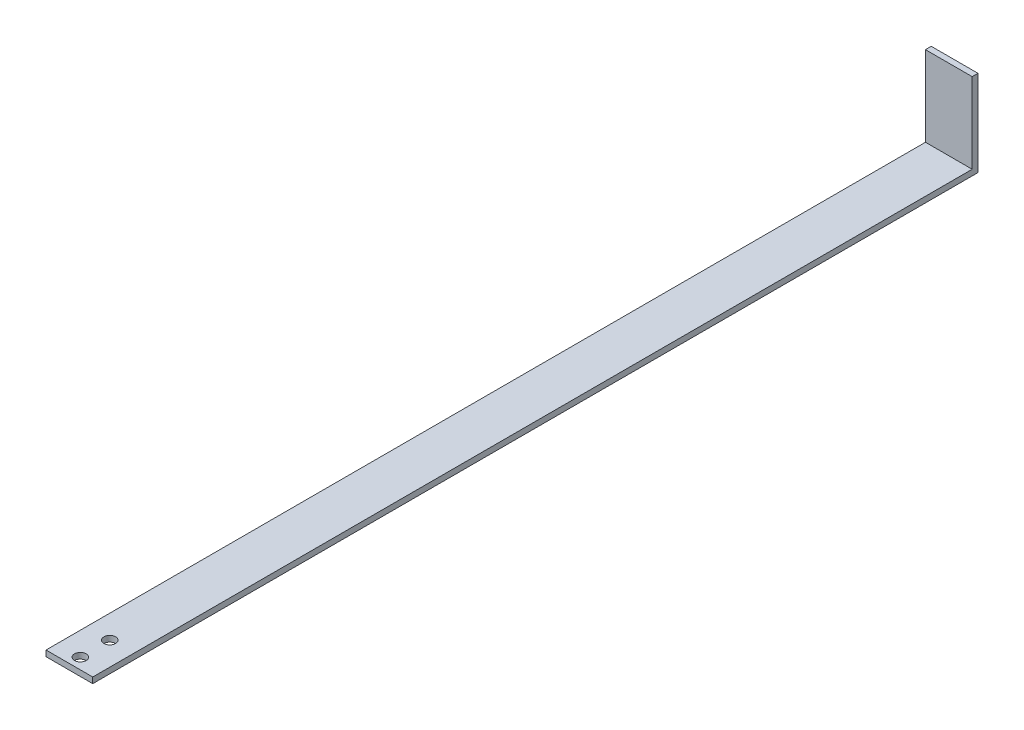
ISO-10303-21;
HEADER;
FILE_DESCRIPTION(('STEP AP214'),'2;1');
FILE_NAME('part.step','',(''),(''),'','','');
FILE_SCHEMA(('AUTOMOTIVE_DESIGN { 1 0 10303 214 1 1 1 1 }'));
ENDSEC;
DATA;
#1=APPLICATION_CONTEXT('core data for automotive mechanical design processes');
#2=APPLICATION_PROTOCOL_DEFINITION('international standard','automotive_design',2000,#1);
#3=PRODUCT_CONTEXT('',#1,'mechanical');
#4=PRODUCT('Part','Part','',(#3));
#5=PRODUCT_RELATED_PRODUCT_CATEGORY('part','',(#4));
#6=PRODUCT_DEFINITION_FORMATION('','',#4);
#7=PRODUCT_DEFINITION_CONTEXT('part definition',#1,'design');
#8=PRODUCT_DEFINITION('design','',#6,#7);
#9=PRODUCT_DEFINITION_SHAPE('','',#8);
#10=(LENGTH_UNIT() NAMED_UNIT(*) SI_UNIT(.MILLI.,.METRE.));
#11=(NAMED_UNIT(*) PLANE_ANGLE_UNIT() SI_UNIT($,.RADIAN.));
#12=(NAMED_UNIT(*) SI_UNIT($,.STERADIAN.) SOLID_ANGLE_UNIT());
#13=UNCERTAINTY_MEASURE_WITH_UNIT(LENGTH_MEASURE(1.E-05),#10,'distance_accuracy_value','');
#14=(GEOMETRIC_REPRESENTATION_CONTEXT(3) GLOBAL_UNCERTAINTY_ASSIGNED_CONTEXT((#13)) GLOBAL_UNIT_ASSIGNED_CONTEXT((#10,
#11,#12)) REPRESENTATION_CONTEXT('',''));
#15=CARTESIAN_POINT('',(0.,0.,0.));
#16=DIRECTION('',(0.,0.,1.));
#17=DIRECTION('',(1.,0.,0.));
#18=AXIS2_PLACEMENT_3D('',#15,#16,#17);
#19=CARTESIAN_POINT('',(50.8,6.3099999999999,6.31000000000004));
#20=DIRECTION('',(0.,0.,-1.));
#21=DIRECTION('',(0.,1.,0.));
#22=AXIS2_PLACEMENT_3D('',#19,#20,#21);
#23=PLANE('',#22);
#24=DIRECTION('',(0.,-1.,0.));
#25=VECTOR('',#24,1.);
#26=CARTESIAN_POINT('',(0.,6.3099999999999,6.31000000000004));
#27=LINE('',#26,#25);
#28=CARTESIAN_POINT('',(0.,93.46,6.31000000000003));
#29=VERTEX_POINT('',#28);
#30=CARTESIAN_POINT('',(0.,6.3099999999999,6.31000000000004));
#31=VERTEX_POINT('',#30);
#32=EDGE_CURVE('E117',#29,#31,#27,.T.);
#33=ORIENTED_EDGE('',*,*,#32,.T.);
#34=DIRECTION('',(-1.,0.,0.));
#35=VECTOR('',#34,1.);
#36=CARTESIAN_POINT('',(50.8,6.3099999999999,6.31000000000004));
#37=LINE('',#36,#35);
#38=CARTESIAN_POINT('',(50.8,6.3099999999999,6.31000000000004));
#39=VERTEX_POINT('',#38);
#40=EDGE_CURVE('E11',#39,#31,#37,.T.);
#41=ORIENTED_EDGE('',*,*,#40,.F.);
#42=DIRECTION('',(0.,-1.,0.));
#43=VECTOR('',#42,1.);
#44=CARTESIAN_POINT('',(50.8,6.3099999999999,6.31000000000004));
#45=LINE('',#44,#43);
#46=CARTESIAN_POINT('',(50.8,93.46,6.31000000000003));
#47=VERTEX_POINT('',#46);
#48=EDGE_CURVE('E128',#47,#39,#45,.T.);
#49=ORIENTED_EDGE('',*,*,#48,.F.);
#50=DIRECTION('',(-1.,0.,0.));
#51=VECTOR('',#50,1.);
#52=CARTESIAN_POINT('',(50.8,93.46,6.31000000000003));
#53=LINE('',#52,#51);
#54=EDGE_CURVE('E113',#47,#29,#53,.T.);
#55=ORIENTED_EDGE('',*,*,#54,.T.);
#56=EDGE_LOOP('',(#33,#41,#49,#55));
#57=FACE_BOUND('',#56,.T.);
#58=ADVANCED_FACE('F33',(#57),#23,.F.);
#59=CARTESIAN_POINT('',(50.8,6.30999999999989,962.));
#60=DIRECTION('',(0.,-1.,0.));
#61=DIRECTION('',(0.,0.,-1.));
#62=AXIS2_PLACEMENT_3D('',#59,#60,#61);
#63=PLANE('',#62);
#64=CARTESIAN_POINT('',(25.4000000000066,6.30999999999989,950.107795334271));
#65=DIRECTION('',(0.,-1.,0.));
#66=DIRECTION('',(0.,0.,-1.));
#67=AXIS2_PLACEMENT_3D('',#64,#65,#66);
#68=CIRCLE('',#67,6.34999999999999);
#69=CARTESIAN_POINT('',(25.4000000000066,6.30999999999989,943.757795334271));
#70=VERTEX_POINT('',#69);
#71=EDGE_CURVE('E176',#70,#70,#68,.T.);
#72=ORIENTED_EDGE('',*,*,#71,.T.);
#73=EDGE_LOOP('',(#72));
#74=FACE_BOUND('',#73,.T.);
#75=CARTESIAN_POINT('',(25.4000000000067,6.30999999999989,918.107795334271));
#76=DIRECTION('',(0.,-1.,0.));
#77=DIRECTION('',(0.,0.,-1.));
#78=AXIS2_PLACEMENT_3D('',#75,#76,#77);
#79=CIRCLE('',#78,6.35000000000003);
#80=CARTESIAN_POINT('',(25.4000000000067,6.30999999999989,911.757795334271));
#81=VERTEX_POINT('',#80);
#82=EDGE_CURVE('E121',#81,#81,#79,.T.);
#83=ORIENTED_EDGE('',*,*,#82,.T.);
#84=EDGE_LOOP('',(#83));
#85=FACE_BOUND('',#84,.T.);
#86=DIRECTION('',(0.,0.,1.));
#87=VECTOR('',#86,1.);
#88=CARTESIAN_POINT('',(0.,6.30999999999989,962.));
#89=LINE('',#88,#87);
#90=CARTESIAN_POINT('',(0.,6.30999999999989,962.));
#91=VERTEX_POINT('',#90);
#92=EDGE_CURVE('E120',#31,#91,#89,.T.);
#93=ORIENTED_EDGE('',*,*,#92,.T.);
#94=DIRECTION('',(-1.,0.,0.));
#95=VECTOR('',#94,1.);
#96=CARTESIAN_POINT('',(50.8,6.30999999999989,962.));
#97=LINE('',#96,#95);
#98=CARTESIAN_POINT('',(50.8,6.30999999999989,962.));
#99=VERTEX_POINT('',#98);
#100=EDGE_CURVE('E41',#99,#91,#97,.T.);
#101=ORIENTED_EDGE('',*,*,#100,.F.);
#102=DIRECTION('',(0.,0.,1.));
#103=VECTOR('',#102,1.);
#104=CARTESIAN_POINT('',(50.8,6.30999999999989,962.));
#105=LINE('',#104,#103);
#106=EDGE_CURVE('E86',#39,#99,#105,.T.);
#107=ORIENTED_EDGE('',*,*,#106,.F.);
#108=ORIENTED_EDGE('',*,*,#40,.T.);
#109=EDGE_LOOP('',(#93,#101,#107,#108));
#110=FACE_BOUND('',#109,.T.);
#111=ADVANCED_FACE('F152',(#74,#85,#110),#63,.F.);
#112=CARTESIAN_POINT('',(50.8,-1.17811022077975E-13,962.));
#113=DIRECTION('',(0.,0.,-1.));
#114=DIRECTION('',(-1.,0.,0.));
#115=AXIS2_PLACEMENT_3D('',#112,#113,#114);
#116=PLANE('',#115);
#117=DIRECTION('',(0.,-1.,0.));
#118=VECTOR('',#117,1.);
#119=CARTESIAN_POINT('',(0.,-1.17811022077975E-13,962.));
#120=LINE('',#119,#118);
#121=CARTESIAN_POINT('',(0.,-1.17811022077975E-13,962.));
#122=VERTEX_POINT('',#121);
#123=EDGE_CURVE('E123',#91,#122,#120,.T.);
#124=ORIENTED_EDGE('',*,*,#123,.T.);
#125=DIRECTION('',(-1.,0.,0.));
#126=VECTOR('',#125,1.);
#127=CARTESIAN_POINT('',(50.8,-1.17811022077975E-13,962.));
#128=LINE('',#127,#126);
#129=CARTESIAN_POINT('',(50.8,-1.17811022077975E-13,962.));
#130=VERTEX_POINT('',#129);
#131=EDGE_CURVE('E108',#130,#122,#128,.T.);
#132=ORIENTED_EDGE('',*,*,#131,.F.);
#133=DIRECTION('',(0.,-1.,0.));
#134=VECTOR('',#133,1.);
#135=CARTESIAN_POINT('',(50.8,-1.17811022077975E-13,962.));
#136=LINE('',#135,#134);
#137=EDGE_CURVE('E99',#99,#130,#136,.T.);
#138=ORIENTED_EDGE('',*,*,#137,.F.);
#139=ORIENTED_EDGE('',*,*,#100,.T.);
#140=EDGE_LOOP('',(#124,#132,#138,#139));
#141=FACE_BOUND('',#140,.T.);
#142=ADVANCED_FACE('F134',(#141),#116,.F.);
#143=CARTESIAN_POINT('',(50.8,0.,0.));
#144=DIRECTION('',(0.,1.,0.));
#145=DIRECTION('',(0.,0.,1.));
#146=AXIS2_PLACEMENT_3D('',#143,#144,#145);
#147=PLANE('',#146);
#148=CARTESIAN_POINT('',(25.4000000000066,-1.16354647040106E-13,950.107795334271));
#149=DIRECTION('',(0.,-1.,0.));
#150=DIRECTION('',(0.,0.,-1.));
#151=AXIS2_PLACEMENT_3D('',#148,#149,#150);
#152=CIRCLE('',#151,6.34999999999999);
#153=CARTESIAN_POINT('',(25.4000000000066,-1.15576996322648E-13,943.757795334271));
#154=VERTEX_POINT('',#153);
#155=EDGE_CURVE('E171',#154,#154,#152,.T.);
#156=ORIENTED_EDGE('',*,*,#155,.F.);
#157=EDGE_LOOP('',(#156));
#158=FACE_BOUND('',#157,.T.);
#159=CARTESIAN_POINT('',(25.4000000000067,-1.12435777282835E-13,918.107795334271));
#160=DIRECTION('',(0.,-1.,0.));
#161=DIRECTION('',(0.,0.,-1.));
#162=AXIS2_PLACEMENT_3D('',#159,#160,#161);
#163=CIRCLE('',#162,6.35000000000003);
#164=CARTESIAN_POINT('',(25.4000000000067,-1.11658126565376E-13,911.757795334271));
#165=VERTEX_POINT('',#164);
#166=EDGE_CURVE('E174',#165,#165,#163,.T.);
#167=ORIENTED_EDGE('',*,*,#166,.F.);
#168=EDGE_LOOP('',(#167));
#169=FACE_BOUND('',#168,.T.);
#170=DIRECTION('',(0.,0.,-1.));
#171=VECTOR('',#170,1.);
#172=CARTESIAN_POINT('',(0.,0.,0.));
#173=LINE('',#172,#171);
#174=CARTESIAN_POINT('',(0.,0.,0.));
#175=VERTEX_POINT('',#174);
#176=EDGE_CURVE('E107',#122,#175,#173,.T.);
#177=ORIENTED_EDGE('',*,*,#176,.T.);
#178=DIRECTION('',(-1.,0.,0.));
#179=VECTOR('',#178,1.);
#180=CARTESIAN_POINT('',(50.8,0.,0.));
#181=LINE('',#180,#179);
#182=CARTESIAN_POINT('',(50.8,0.,0.));
#183=VERTEX_POINT('',#182);
#184=EDGE_CURVE('E104',#183,#175,#181,.T.);
#185=ORIENTED_EDGE('',*,*,#184,.F.);
#186=DIRECTION('',(0.,0.,-1.));
#187=VECTOR('',#186,1.);
#188=CARTESIAN_POINT('',(50.8,0.,0.));
#189=LINE('',#188,#187);
#190=EDGE_CURVE('E93',#130,#183,#189,.T.);
#191=ORIENTED_EDGE('',*,*,#190,.F.);
#192=ORIENTED_EDGE('',*,*,#131,.T.);
#193=EDGE_LOOP('',(#177,#185,#191,#192));
#194=FACE_BOUND('',#193,.T.);
#195=ADVANCED_FACE('F105',(#158,#169,#194),#147,.F.);
#196=CARTESIAN_POINT('',(50.8,93.46,0.));
#197=DIRECTION('',(0.,0.,1.));
#198=DIRECTION('',(0.,-1.,0.));
#199=AXIS2_PLACEMENT_3D('',#196,#197,#198);
#200=PLANE('',#199);
#201=DIRECTION('',(0.,1.,0.));
#202=VECTOR('',#201,1.);
#203=CARTESIAN_POINT('',(0.,93.46,0.));
#204=LINE('',#203,#202);
#205=CARTESIAN_POINT('',(0.,93.46,0.));
#206=VERTEX_POINT('',#205);
#207=EDGE_CURVE('E72',#175,#206,#204,.T.);
#208=ORIENTED_EDGE('',*,*,#207,.T.);
#209=DIRECTION('',(-1.,0.,0.));
#210=VECTOR('',#209,1.);
#211=CARTESIAN_POINT('',(50.8,93.46,0.));
#212=LINE('',#211,#210);
#213=CARTESIAN_POINT('',(50.8,93.46,0.));
#214=VERTEX_POINT('',#213);
#215=EDGE_CURVE('E109',#214,#206,#212,.T.);
#216=ORIENTED_EDGE('',*,*,#215,.F.);
#217=DIRECTION('',(0.,1.,0.));
#218=VECTOR('',#217,1.);
#219=CARTESIAN_POINT('',(50.8,93.46,0.));
#220=LINE('',#219,#218);
#221=EDGE_CURVE('E97',#183,#214,#220,.T.);
#222=ORIENTED_EDGE('',*,*,#221,.F.);
#223=ORIENTED_EDGE('',*,*,#184,.T.);
#224=EDGE_LOOP('',(#208,#216,#222,#223));
#225=FACE_BOUND('',#224,.T.);
#226=ADVANCED_FACE('F111',(#225),#200,.F.);
#227=CARTESIAN_POINT('',(50.8,93.46,6.31000000000003));
#228=DIRECTION('',(0.,-1.,0.));
#229=DIRECTION('',(0.,0.,-1.));
#230=AXIS2_PLACEMENT_3D('',#227,#228,#229);
#231=PLANE('',#230);
#232=DIRECTION('',(0.,0.,1.));
#233=VECTOR('',#232,1.);
#234=CARTESIAN_POINT('',(0.,93.46,6.31000000000003));
#235=LINE('',#234,#233);
#236=EDGE_CURVE('E78',#206,#29,#235,.T.);
#237=ORIENTED_EDGE('',*,*,#236,.T.);
#238=ORIENTED_EDGE('',*,*,#54,.F.);
#239=DIRECTION('',(0.,0.,1.));
#240=VECTOR('',#239,1.);
#241=CARTESIAN_POINT('',(50.8,93.46,6.31000000000003));
#242=LINE('',#241,#240);
#243=EDGE_CURVE('E49',#214,#47,#242,.T.);
#244=ORIENTED_EDGE('',*,*,#243,.F.);
#245=ORIENTED_EDGE('',*,*,#215,.T.);
#246=EDGE_LOOP('',(#237,#238,#244,#245));
#247=FACE_BOUND('',#246,.T.);
#248=ADVANCED_FACE('F141',(#247),#231,.F.);
#249=CARTESIAN_POINT('',(50.8,0.,0.));
#250=DIRECTION('',(-1.,0.,0.));
#251=DIRECTION('',(0.,0.,1.));
#252=AXIS2_PLACEMENT_3D('',#249,#250,#251);
#253=PLANE('',#252);
#254=ORIENTED_EDGE('',*,*,#48,.T.);
#255=ORIENTED_EDGE('',*,*,#106,.T.);
#256=ORIENTED_EDGE('',*,*,#137,.T.);
#257=ORIENTED_EDGE('',*,*,#190,.T.);
#258=ORIENTED_EDGE('',*,*,#221,.T.);
#259=ORIENTED_EDGE('',*,*,#243,.T.);
#260=EDGE_LOOP('',(#254,#255,#256,#257,#258,#259));
#261=FACE_BOUND('',#260,.T.);
#262=ADVANCED_FACE('F95',(#261),#253,.F.);
#263=CARTESIAN_POINT('',(0.,0.,0.));
#264=DIRECTION('',(-1.,0.,0.));
#265=DIRECTION('',(0.,0.,1.));
#266=AXIS2_PLACEMENT_3D('',#263,#264,#265);
#267=PLANE('',#266);
#268=ORIENTED_EDGE('',*,*,#32,.F.);
#269=ORIENTED_EDGE('',*,*,#236,.F.);
#270=ORIENTED_EDGE('',*,*,#207,.F.);
#271=ORIENTED_EDGE('',*,*,#176,.F.);
#272=ORIENTED_EDGE('',*,*,#123,.F.);
#273=ORIENTED_EDGE('',*,*,#92,.F.);
#274=EDGE_LOOP('',(#268,#269,#270,#271,#272,#273));
#275=FACE_BOUND('',#274,.T.);
#276=ADVANCED_FACE('F137',(#275),#267,.T.);
#277=CARTESIAN_POINT('',(25.4000000000067,9.99999999999989,918.107795334271));
#278=DIRECTION('',(0.,-1.,0.));
#279=DIRECTION('',(0.,0.,-1.));
#280=AXIS2_PLACEMENT_3D('',#277,#278,#279);
#281=CYLINDRICAL_SURFACE('',#280,6.35000000000003);
#282=ORIENTED_EDGE('',*,*,#166,.T.);
#283=EDGE_LOOP('',(#282));
#284=FACE_BOUND('',#283,.T.);
#285=ORIENTED_EDGE('',*,*,#82,.F.);
#286=EDGE_LOOP('',(#285));
#287=FACE_BOUND('',#286,.T.);
#288=ADVANCED_FACE('F188',(#284,#287),#281,.F.);
#289=CARTESIAN_POINT('',(25.4000000000066,9.99999999999988,950.107795334271));
#290=DIRECTION('',(0.,-1.,0.));
#291=DIRECTION('',(0.,0.,-1.));
#292=AXIS2_PLACEMENT_3D('',#289,#290,#291);
#293=CYLINDRICAL_SURFACE('',#292,6.34999999999999);
#294=ORIENTED_EDGE('',*,*,#155,.T.);
#295=EDGE_LOOP('',(#294));
#296=FACE_BOUND('',#295,.T.);
#297=ORIENTED_EDGE('',*,*,#71,.F.);
#298=EDGE_LOOP('',(#297));
#299=FACE_BOUND('',#298,.T.);
#300=ADVANCED_FACE('F185',(#296,#299),#293,.F.);
#301=CLOSED_SHELL('',(#58,#111,#142,#195,#226,#248,#262,#276,#288,#300));
#302=MANIFOLD_SOLID_BREP('B2',#301);
#303=ADVANCED_BREP_SHAPE_REPRESENTATION('',(#18,#302),#14);
#304=SHAPE_DEFINITION_REPRESENTATION(#9,#303);
ENDSEC;
END-ISO-10303-21;
